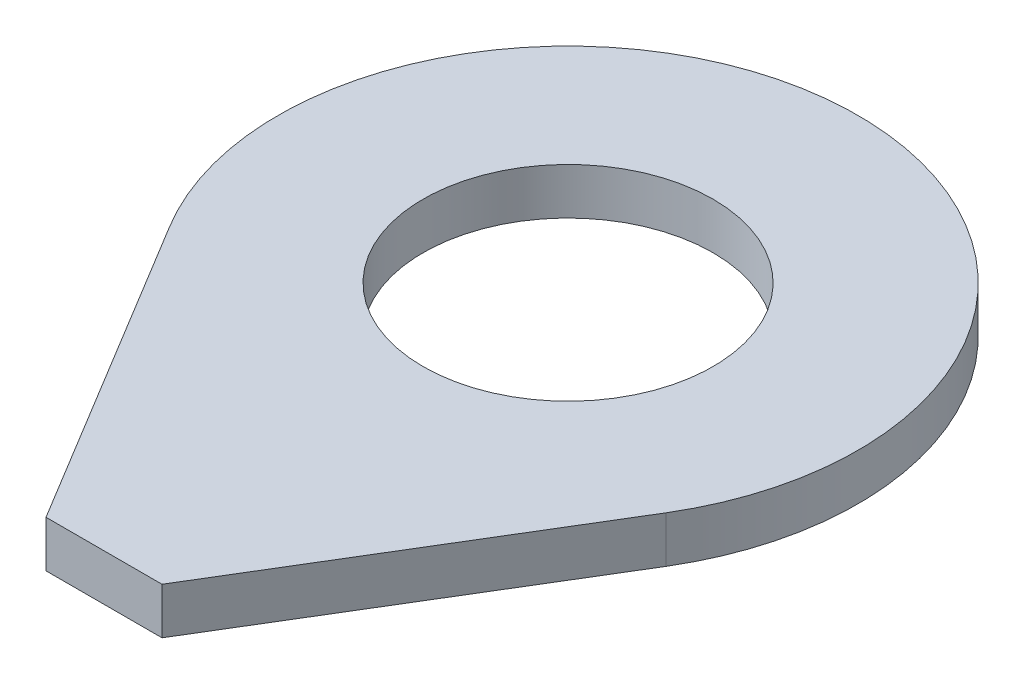
ISO-10303-21;
HEADER;
FILE_DESCRIPTION(('STEP AP214'),'2;1');
FILE_NAME('part.step','',(''),(''),'','','');
FILE_SCHEMA(('AUTOMOTIVE_DESIGN { 1 0 10303 214 1 1 1 1 }'));
ENDSEC;
DATA;
#1=APPLICATION_CONTEXT('core data for automotive mechanical design processes');
#2=APPLICATION_PROTOCOL_DEFINITION('international standard','automotive_design',2000,#1);
#3=PRODUCT_CONTEXT('',#1,'mechanical');
#4=PRODUCT('Part','Part','',(#3));
#5=PRODUCT_RELATED_PRODUCT_CATEGORY('part','',(#4));
#6=PRODUCT_DEFINITION_FORMATION('','',#4);
#7=PRODUCT_DEFINITION_CONTEXT('part definition',#1,'design');
#8=PRODUCT_DEFINITION('design','',#6,#7);
#9=PRODUCT_DEFINITION_SHAPE('','',#8);
#10=(LENGTH_UNIT() NAMED_UNIT(*) SI_UNIT(.MILLI.,.METRE.));
#11=(NAMED_UNIT(*) PLANE_ANGLE_UNIT() SI_UNIT($,.RADIAN.));
#12=(NAMED_UNIT(*) SI_UNIT($,.STERADIAN.) SOLID_ANGLE_UNIT());
#13=UNCERTAINTY_MEASURE_WITH_UNIT(LENGTH_MEASURE(1.E-05),#10,'distance_accuracy_value','');
#14=(GEOMETRIC_REPRESENTATION_CONTEXT(3) GLOBAL_UNCERTAINTY_ASSIGNED_CONTEXT((#13)) GLOBAL_UNIT_ASSIGNED_CONTEXT((#10,
#11,#12)) REPRESENTATION_CONTEXT('',''));
#15=CARTESIAN_POINT('',(0.,0.,0.));
#16=DIRECTION('',(0.,0.,1.));
#17=DIRECTION('',(1.,0.,0.));
#18=AXIS2_PLACEMENT_3D('',#15,#16,#17);
#19=CARTESIAN_POINT('',(0.,0.8,0.));
#20=DIRECTION('',(0.,1.,0.));
#21=DIRECTION('',(0.,0.,1.));
#22=AXIS2_PLACEMENT_3D('',#19,#20,#21);
#23=PLANE('',#22);
#24=CARTESIAN_POINT('',(0.,0.8,0.));
#25=DIRECTION('',(0.,1.,0.));
#26=DIRECTION('',(0.,0.,1.));
#27=AXIS2_PLACEMENT_3D('',#24,#25,#26);
#28=CIRCLE('',#27,5.);
#29=CARTESIAN_POINT('',(4.27664942789954,0.8,2.59041882151256));
#30=VERTEX_POINT('',#29);
#31=CARTESIAN_POINT('',(-4.27664942789954,0.8,2.59041882151256));
#32=VERTEX_POINT('',#31);
#33=EDGE_CURVE('E87',#30,#32,#28,.T.);
#34=ORIENTED_EDGE('',*,*,#33,.T.);
#35=DIRECTION('',(0.518083764302511,0.,0.855329885579909));
#36=VECTOR('',#35,1.);
#37=CARTESIAN_POINT('',(-4.27664942789954,0.8,2.59041882151256));
#38=LINE('',#37,#36);
#39=CARTESIAN_POINT('',(-1.,0.8,8.));
#40=VERTEX_POINT('',#39);
#41=EDGE_CURVE('E82',#32,#40,#38,.T.);
#42=ORIENTED_EDGE('',*,*,#41,.T.);
#43=DIRECTION('',(1.,0.,0.));
#44=VECTOR('',#43,1.);
#45=CARTESIAN_POINT('',(1.,0.8,8.));
#46=LINE('',#45,#44);
#47=CARTESIAN_POINT('',(1.,0.8,8.));
#48=VERTEX_POINT('',#47);
#49=EDGE_CURVE('E85',#40,#48,#46,.T.);
#50=ORIENTED_EDGE('',*,*,#49,.T.);
#51=DIRECTION('',(0.518083764302511,0.,-0.855329885579909));
#52=VECTOR('',#51,1.);
#53=CARTESIAN_POINT('',(4.27664942789954,0.8,2.59041882151256));
#54=LINE('',#53,#52);
#55=EDGE_CURVE('E52',#48,#30,#54,.T.);
#56=ORIENTED_EDGE('',*,*,#55,.T.);
#57=EDGE_LOOP('',(#34,#42,#50,#56));
#58=FACE_BOUND('',#57,.T.);
#59=CARTESIAN_POINT('',(0.,0.8,0.));
#60=DIRECTION('',(0.,1.,0.));
#61=DIRECTION('',(0.,0.,1.));
#62=AXIS2_PLACEMENT_3D('',#59,#60,#61);
#63=CIRCLE('',#62,2.5);
#64=CARTESIAN_POINT('',(0.,0.8,2.5));
#65=VERTEX_POINT('',#64);
#66=EDGE_CURVE('E102',#65,#65,#63,.T.);
#67=ORIENTED_EDGE('',*,*,#66,.F.);
#68=EDGE_LOOP('',(#67));
#69=FACE_BOUND('',#68,.T.);
#70=ADVANCED_FACE('F35',(#58,#69),#23,.T.);
#71=CARTESIAN_POINT('',(0.,0.,0.));
#72=DIRECTION('',(0.,1.,0.));
#73=DIRECTION('',(0.,0.,1.));
#74=AXIS2_PLACEMENT_3D('',#71,#72,#73);
#75=PLANE('',#74);
#76=CARTESIAN_POINT('',(0.,0.,0.));
#77=DIRECTION('',(0.,1.,0.));
#78=DIRECTION('',(0.,0.,1.));
#79=AXIS2_PLACEMENT_3D('',#76,#77,#78);
#80=CIRCLE('',#79,5.);
#81=CARTESIAN_POINT('',(4.27664942789954,0.,2.59041882151256));
#82=VERTEX_POINT('',#81);
#83=CARTESIAN_POINT('',(-4.27664942789954,0.,2.59041882151256));
#84=VERTEX_POINT('',#83);
#85=EDGE_CURVE('E99',#82,#84,#80,.T.);
#86=ORIENTED_EDGE('',*,*,#85,.F.);
#87=DIRECTION('',(0.518083764302511,0.,-0.855329885579909));
#88=VECTOR('',#87,1.);
#89=CARTESIAN_POINT('',(4.27664942789954,0.,2.59041882151256));
#90=LINE('',#89,#88);
#91=CARTESIAN_POINT('',(1.,0.,8.));
#92=VERTEX_POINT('',#91);
#93=EDGE_CURVE('E75',#92,#82,#90,.T.);
#94=ORIENTED_EDGE('',*,*,#93,.F.);
#95=DIRECTION('',(1.,0.,0.));
#96=VECTOR('',#95,1.);
#97=CARTESIAN_POINT('',(1.,0.,8.));
#98=LINE('',#97,#96);
#99=CARTESIAN_POINT('',(-1.,0.,8.));
#100=VERTEX_POINT('',#99);
#101=EDGE_CURVE('E69',#100,#92,#98,.T.);
#102=ORIENTED_EDGE('',*,*,#101,.F.);
#103=DIRECTION('',(0.518083764302511,0.,0.855329885579909));
#104=VECTOR('',#103,1.);
#105=CARTESIAN_POINT('',(-4.27664942789954,0.,2.59041882151256));
#106=LINE('',#105,#104);
#107=EDGE_CURVE('E91',#84,#100,#106,.T.);
#108=ORIENTED_EDGE('',*,*,#107,.F.);
#109=EDGE_LOOP('',(#86,#94,#102,#108));
#110=FACE_BOUND('',#109,.T.);
#111=CARTESIAN_POINT('',(0.,0.,0.));
#112=DIRECTION('',(0.,1.,0.));
#113=DIRECTION('',(0.,0.,1.));
#114=AXIS2_PLACEMENT_3D('',#111,#112,#113);
#115=CIRCLE('',#114,2.5);
#116=CARTESIAN_POINT('',(0.,0.,2.5));
#117=VERTEX_POINT('',#116);
#118=EDGE_CURVE('E114',#117,#117,#115,.T.);
#119=ORIENTED_EDGE('',*,*,#118,.T.);
#120=EDGE_LOOP('',(#119));
#121=FACE_BOUND('',#120,.T.);
#122=ADVANCED_FACE('F110',(#110,#121),#75,.F.);
#123=CARTESIAN_POINT('',(0.,0.8,0.));
#124=DIRECTION('',(0.,-1.,0.));
#125=DIRECTION('',(0.,0.,-1.));
#126=AXIS2_PLACEMENT_3D('',#123,#124,#125);
#127=CYLINDRICAL_SURFACE('',#126,5.);
#128=ORIENTED_EDGE('',*,*,#85,.T.);
#129=DIRECTION('',(0.,-1.,0.));
#130=VECTOR('',#129,1.);
#131=CARTESIAN_POINT('',(-4.27664942789954,0.8,2.59041882151256));
#132=LINE('',#131,#130);
#133=EDGE_CURVE('E11',#32,#84,#132,.T.);
#134=ORIENTED_EDGE('',*,*,#133,.F.);
#135=ORIENTED_EDGE('',*,*,#33,.F.);
#136=DIRECTION('',(0.,-1.,0.));
#137=VECTOR('',#136,1.);
#138=CARTESIAN_POINT('',(4.27664942789954,0.8,2.59041882151256));
#139=LINE('',#138,#137);
#140=EDGE_CURVE('E95',#30,#82,#139,.T.);
#141=ORIENTED_EDGE('',*,*,#140,.T.);
#142=EDGE_LOOP('',(#128,#134,#135,#141));
#143=FACE_BOUND('',#142,.T.);
#144=ADVANCED_FACE('F37',(#143),#127,.T.);
#145=CARTESIAN_POINT('',(-4.27664942789954,0.8,2.59041882151256));
#146=DIRECTION('',(0.855329885579909,0.,-0.518083764302511));
#147=DIRECTION('',(-0.518083764302511,0.,-0.855329885579909));
#148=AXIS2_PLACEMENT_3D('',#145,#146,#147);
#149=PLANE('',#148);
#150=ORIENTED_EDGE('',*,*,#107,.T.);
#151=DIRECTION('',(0.,-1.,0.));
#152=VECTOR('',#151,1.);
#153=CARTESIAN_POINT('',(-1.,0.8,8.));
#154=LINE('',#153,#152);
#155=EDGE_CURVE('E44',#40,#100,#154,.T.);
#156=ORIENTED_EDGE('',*,*,#155,.F.);
#157=ORIENTED_EDGE('',*,*,#41,.F.);
#158=ORIENTED_EDGE('',*,*,#133,.T.);
#159=EDGE_LOOP('',(#150,#156,#157,#158));
#160=FACE_BOUND('',#159,.T.);
#161=ADVANCED_FACE('F90',(#160),#149,.F.);
#162=CARTESIAN_POINT('',(1.,0.8,8.));
#163=DIRECTION('',(0.,0.,-1.));
#164=DIRECTION('',(-1.,0.,0.));
#165=AXIS2_PLACEMENT_3D('',#162,#163,#164);
#166=PLANE('',#165);
#167=ORIENTED_EDGE('',*,*,#101,.T.);
#168=DIRECTION('',(0.,-1.,0.));
#169=VECTOR('',#168,1.);
#170=CARTESIAN_POINT('',(1.,0.8,8.));
#171=LINE('',#170,#169);
#172=EDGE_CURVE('E92',#48,#92,#171,.T.);
#173=ORIENTED_EDGE('',*,*,#172,.F.);
#174=ORIENTED_EDGE('',*,*,#49,.F.);
#175=ORIENTED_EDGE('',*,*,#155,.T.);
#176=EDGE_LOOP('',(#167,#173,#174,#175));
#177=FACE_BOUND('',#176,.T.);
#178=ADVANCED_FACE('F93',(#177),#166,.F.);
#179=CARTESIAN_POINT('',(4.27664942789954,0.8,2.59041882151256));
#180=DIRECTION('',(-0.855329885579909,0.,-0.518083764302511));
#181=DIRECTION('',(-0.518083764302511,0.,0.855329885579909));
#182=AXIS2_PLACEMENT_3D('',#179,#180,#181);
#183=PLANE('',#182);
#184=ORIENTED_EDGE('',*,*,#93,.T.);
#185=ORIENTED_EDGE('',*,*,#140,.F.);
#186=ORIENTED_EDGE('',*,*,#55,.F.);
#187=ORIENTED_EDGE('',*,*,#172,.T.);
#188=EDGE_LOOP('',(#184,#185,#186,#187));
#189=FACE_BOUND('',#188,.T.);
#190=ADVANCED_FACE('F107',(#189),#183,.F.);
#191=CARTESIAN_POINT('',(0.,0.8,0.));
#192=DIRECTION('',(0.,-1.,0.));
#193=DIRECTION('',(0.,0.,-1.));
#194=AXIS2_PLACEMENT_3D('',#191,#192,#193);
#195=CYLINDRICAL_SURFACE('',#194,2.5);
#196=ORIENTED_EDGE('',*,*,#66,.T.);
#197=EDGE_LOOP('',(#196));
#198=FACE_BOUND('',#197,.T.);
#199=ORIENTED_EDGE('',*,*,#118,.F.);
#200=EDGE_LOOP('',(#199));
#201=FACE_BOUND('',#200,.T.);
#202=ADVANCED_FACE('F120',(#198,#201),#195,.F.);
#203=CLOSED_SHELL('',(#70,#122,#144,#161,#178,#190,#202));
#204=MANIFOLD_SOLID_BREP('B2',#203);
#205=ADVANCED_BREP_SHAPE_REPRESENTATION('',(#18,#204),#14);
#206=SHAPE_DEFINITION_REPRESENTATION(#9,#205);
ENDSEC;
END-ISO-10303-21;
